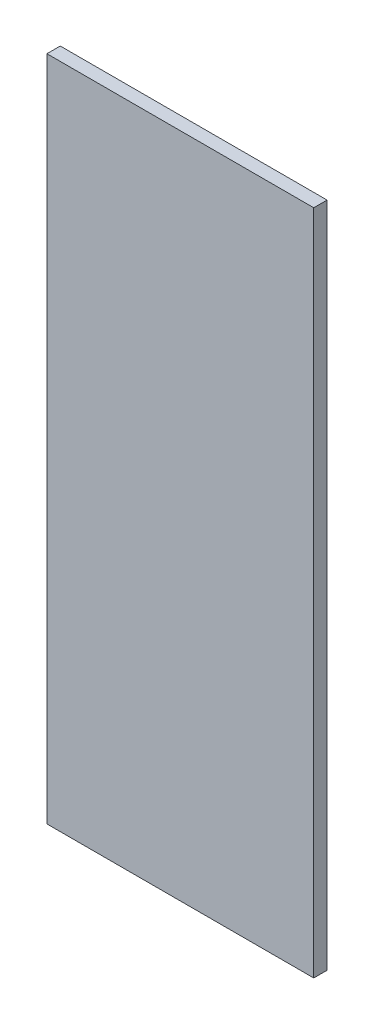
ISO-10303-21;
HEADER;
FILE_DESCRIPTION(('STEP AP214'),'2;1');
FILE_NAME('part.step','',(''),(''),'','','');
FILE_SCHEMA(('AUTOMOTIVE_DESIGN { 1 0 10303 214 1 1 1 1 }'));
ENDSEC;
DATA;
#1=APPLICATION_CONTEXT('core data for automotive mechanical design processes');
#2=APPLICATION_PROTOCOL_DEFINITION('international standard','automotive_design',2000,#1);
#3=PRODUCT_CONTEXT('',#1,'mechanical');
#4=PRODUCT('Part','Part','',(#3));
#5=PRODUCT_RELATED_PRODUCT_CATEGORY('part','',(#4));
#6=PRODUCT_DEFINITION_FORMATION('','',#4);
#7=PRODUCT_DEFINITION_CONTEXT('part definition',#1,'design');
#8=PRODUCT_DEFINITION('design','',#6,#7);
#9=PRODUCT_DEFINITION_SHAPE('','',#8);
#10=(LENGTH_UNIT() NAMED_UNIT(*) SI_UNIT(.MILLI.,.METRE.));
#11=(NAMED_UNIT(*) PLANE_ANGLE_UNIT() SI_UNIT($,.RADIAN.));
#12=(NAMED_UNIT(*) SI_UNIT($,.STERADIAN.) SOLID_ANGLE_UNIT());
#13=UNCERTAINTY_MEASURE_WITH_UNIT(LENGTH_MEASURE(1.E-05),#10,'distance_accuracy_value','');
#14=(GEOMETRIC_REPRESENTATION_CONTEXT(3) GLOBAL_UNCERTAINTY_ASSIGNED_CONTEXT((#13)) GLOBAL_UNIT_ASSIGNED_CONTEXT((#10,
#11,#12)) REPRESENTATION_CONTEXT('',''));
#15=CARTESIAN_POINT('',(0.,0.,0.));
#16=DIRECTION('',(0.,0.,1.));
#17=DIRECTION('',(1.,0.,0.));
#18=AXIS2_PLACEMENT_3D('',#15,#16,#17);
#19=CARTESIAN_POINT('',(-20.,100.,-1.));
#20=DIRECTION('',(1.,0.,0.));
#21=DIRECTION('',(0.,0.,-1.));
#22=AXIS2_PLACEMENT_3D('',#19,#20,#21);
#23=PLANE('',#22);
#24=DIRECTION('',(0.,0.,1.));
#25=VECTOR('',#24,1.);
#26=CARTESIAN_POINT('',(-20.,0.,-1.));
#27=LINE('',#26,#25);
#28=CARTESIAN_POINT('',(-20.,0.,-1.));
#29=VERTEX_POINT('',#28);
#30=CARTESIAN_POINT('',(-20.,0.,1.));
#31=VERTEX_POINT('',#30);
#32=EDGE_CURVE('E107',#29,#31,#27,.T.);
#33=ORIENTED_EDGE('',*,*,#32,.T.);
#34=DIRECTION('',(0.,-1.,0.));
#35=VECTOR('',#34,1.);
#36=CARTESIAN_POINT('',(-20.,100.,1.));
#37=LINE('',#36,#35);
#38=CARTESIAN_POINT('',(-20.,100.,1.));
#39=VERTEX_POINT('',#38);
#40=EDGE_CURVE('E11',#39,#31,#37,.T.);
#41=ORIENTED_EDGE('',*,*,#40,.F.);
#42=DIRECTION('',(0.,0.,1.));
#43=VECTOR('',#42,1.);
#44=CARTESIAN_POINT('',(-20.,100.,-1.));
#45=LINE('',#44,#43);
#46=CARTESIAN_POINT('',(-20.,100.,-1.));
#47=VERTEX_POINT('',#46);
#48=EDGE_CURVE('E91',#47,#39,#45,.T.);
#49=ORIENTED_EDGE('',*,*,#48,.F.);
#50=DIRECTION('',(0.,-1.,0.));
#51=VECTOR('',#50,1.);
#52=CARTESIAN_POINT('',(-20.,100.,-1.));
#53=LINE('',#52,#51);
#54=EDGE_CURVE('E103',#47,#29,#53,.T.);
#55=ORIENTED_EDGE('',*,*,#54,.T.);
#56=EDGE_LOOP('',(#33,#41,#49,#55));
#57=FACE_BOUND('',#56,.T.);
#58=ADVANCED_FACE('F39',(#57),#23,.F.);
#59=CARTESIAN_POINT('',(-20.,100.,1.));
#60=DIRECTION('',(0.,0.,-1.));
#61=DIRECTION('',(-1.,0.,0.));
#62=AXIS2_PLACEMENT_3D('',#59,#60,#61);
#63=PLANE('',#62);
#64=DIRECTION('',(1.,0.,0.));
#65=VECTOR('',#64,1.);
#66=CARTESIAN_POINT('',(-20.,0.,1.));
#67=LINE('',#66,#65);
#68=CARTESIAN_POINT('',(20.,0.,1.));
#69=VERTEX_POINT('',#68);
#70=EDGE_CURVE('E96',#31,#69,#67,.T.);
#71=ORIENTED_EDGE('',*,*,#70,.T.);
#72=DIRECTION('',(0.,-1.,0.));
#73=VECTOR('',#72,1.);
#74=CARTESIAN_POINT('',(20.,100.,1.));
#75=LINE('',#74,#73);
#76=CARTESIAN_POINT('',(20.,100.,1.));
#77=VERTEX_POINT('',#76);
#78=EDGE_CURVE('E48',#77,#69,#75,.T.);
#79=ORIENTED_EDGE('',*,*,#78,.F.);
#80=DIRECTION('',(1.,0.,0.));
#81=VECTOR('',#80,1.);
#82=CARTESIAN_POINT('',(-20.,100.,1.));
#83=LINE('',#82,#81);
#84=EDGE_CURVE('E86',#39,#77,#83,.T.);
#85=ORIENTED_EDGE('',*,*,#84,.F.);
#86=ORIENTED_EDGE('',*,*,#40,.T.);
#87=EDGE_LOOP('',(#71,#79,#85,#86));
#88=FACE_BOUND('',#87,.T.);
#89=ADVANCED_FACE('F95',(#88),#63,.F.);
#90=CARTESIAN_POINT('',(20.,100.,-1.));
#91=DIRECTION('',(-1.,0.,0.));
#92=DIRECTION('',(0.,0.,1.));
#93=AXIS2_PLACEMENT_3D('',#90,#91,#92);
#94=PLANE('',#93);
#95=DIRECTION('',(0.,0.,-1.));
#96=VECTOR('',#95,1.);
#97=CARTESIAN_POINT('',(20.,0.,-1.));
#98=LINE('',#97,#96);
#99=CARTESIAN_POINT('',(20.,0.,-1.));
#100=VERTEX_POINT('',#99);
#101=EDGE_CURVE('E73',#69,#100,#98,.T.);
#102=ORIENTED_EDGE('',*,*,#101,.T.);
#103=DIRECTION('',(0.,-1.,0.));
#104=VECTOR('',#103,1.);
#105=CARTESIAN_POINT('',(20.,100.,-1.));
#106=LINE('',#105,#104);
#107=CARTESIAN_POINT('',(20.,100.,-1.));
#108=VERTEX_POINT('',#107);
#109=EDGE_CURVE('E98',#108,#100,#106,.T.);
#110=ORIENTED_EDGE('',*,*,#109,.F.);
#111=DIRECTION('',(0.,0.,-1.));
#112=VECTOR('',#111,1.);
#113=CARTESIAN_POINT('',(20.,100.,-1.));
#114=LINE('',#113,#112);
#115=EDGE_CURVE('E89',#77,#108,#114,.T.);
#116=ORIENTED_EDGE('',*,*,#115,.F.);
#117=ORIENTED_EDGE('',*,*,#78,.T.);
#118=EDGE_LOOP('',(#102,#110,#116,#117));
#119=FACE_BOUND('',#118,.T.);
#120=ADVANCED_FACE('F99',(#119),#94,.F.);
#121=CARTESIAN_POINT('',(-20.,100.,-1.));
#122=DIRECTION('',(0.,0.,1.));
#123=DIRECTION('',(1.,0.,0.));
#124=AXIS2_PLACEMENT_3D('',#121,#122,#123);
#125=PLANE('',#124);
#126=DIRECTION('',(-1.,0.,0.));
#127=VECTOR('',#126,1.);
#128=CARTESIAN_POINT('',(-20.,0.,-1.));
#129=LINE('',#128,#127);
#130=EDGE_CURVE('E79',#100,#29,#129,.T.);
#131=ORIENTED_EDGE('',*,*,#130,.T.);
#132=ORIENTED_EDGE('',*,*,#54,.F.);
#133=DIRECTION('',(-1.,0.,0.));
#134=VECTOR('',#133,1.);
#135=CARTESIAN_POINT('',(-20.,100.,-1.));
#136=LINE('',#135,#134);
#137=EDGE_CURVE('E56',#108,#47,#136,.T.);
#138=ORIENTED_EDGE('',*,*,#137,.F.);
#139=ORIENTED_EDGE('',*,*,#109,.T.);
#140=EDGE_LOOP('',(#131,#132,#138,#139));
#141=FACE_BOUND('',#140,.T.);
#142=ADVANCED_FACE('F120',(#141),#125,.F.);
#143=CARTESIAN_POINT('',(0.,100.,0.));
#144=DIRECTION('',(0.,1.,0.));
#145=DIRECTION('',(0.,0.,1.));
#146=AXIS2_PLACEMENT_3D('',#143,#144,#145);
#147=PLANE('',#146);
#148=ORIENTED_EDGE('',*,*,#48,.T.);
#149=ORIENTED_EDGE('',*,*,#84,.T.);
#150=ORIENTED_EDGE('',*,*,#115,.T.);
#151=ORIENTED_EDGE('',*,*,#137,.T.);
#152=EDGE_LOOP('',(#148,#149,#150,#151));
#153=FACE_BOUND('',#152,.T.);
#154=ADVANCED_FACE('F87',(#153),#147,.T.);
#155=CARTESIAN_POINT('',(0.,0.,0.));
#156=DIRECTION('',(0.,1.,0.));
#157=DIRECTION('',(0.,0.,1.));
#158=AXIS2_PLACEMENT_3D('',#155,#156,#157);
#159=PLANE('',#158);
#160=ORIENTED_EDGE('',*,*,#32,.F.);
#161=ORIENTED_EDGE('',*,*,#130,.F.);
#162=ORIENTED_EDGE('',*,*,#101,.F.);
#163=ORIENTED_EDGE('',*,*,#70,.F.);
#164=EDGE_LOOP('',(#160,#161,#162,#163));
#165=FACE_BOUND('',#164,.T.);
#166=ADVANCED_FACE('F123',(#165),#159,.F.);
#167=CLOSED_SHELL('',(#58,#89,#120,#142,#154,#166));
#168=MANIFOLD_SOLID_BREP('B2',#167);
#169=ADVANCED_BREP_SHAPE_REPRESENTATION('',(#18,#168),#14);
#170=SHAPE_DEFINITION_REPRESENTATION(#9,#169);
ENDSEC;
END-ISO-10303-21;
